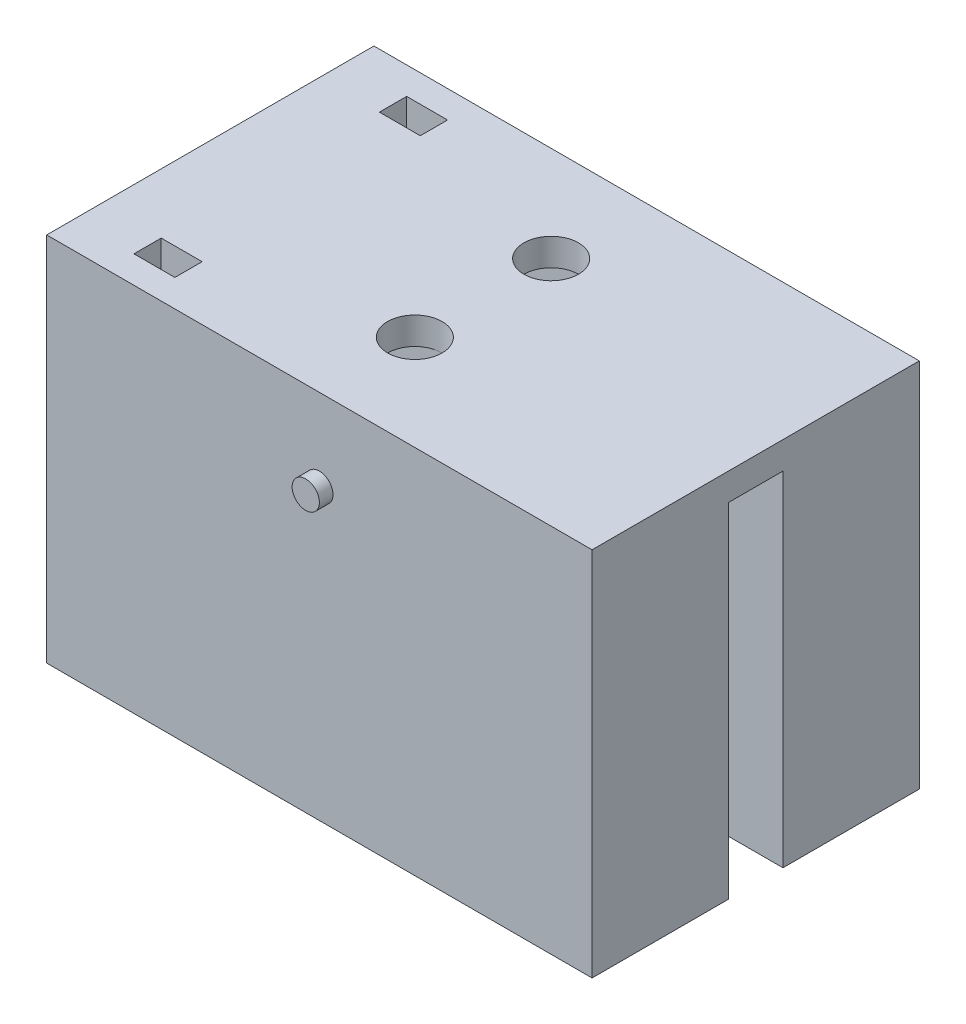
ISO-10303-21;
HEADER;
FILE_DESCRIPTION(('STEP AP214'),'2;1');
FILE_NAME('part.step','',(''),(''),'','','');
FILE_SCHEMA(('AUTOMOTIVE_DESIGN { 1 0 10303 214 1 1 1 1 }'));
ENDSEC;
DATA;
#1=APPLICATION_CONTEXT('core data for automotive mechanical design processes');
#2=APPLICATION_PROTOCOL_DEFINITION('international standard','automotive_design',2000,#1);
#3=PRODUCT_CONTEXT('',#1,'mechanical');
#4=PRODUCT('Part','Part','',(#3));
#5=PRODUCT_RELATED_PRODUCT_CATEGORY('part','',(#4));
#6=PRODUCT_DEFINITION_FORMATION('','',#4);
#7=PRODUCT_DEFINITION_CONTEXT('part definition',#1,'design');
#8=PRODUCT_DEFINITION('design','',#6,#7);
#9=PRODUCT_DEFINITION_SHAPE('','',#8);
#10=(LENGTH_UNIT() NAMED_UNIT(*) SI_UNIT(.MILLI.,.METRE.));
#11=(NAMED_UNIT(*) PLANE_ANGLE_UNIT() SI_UNIT($,.RADIAN.));
#12=(NAMED_UNIT(*) SI_UNIT($,.STERADIAN.) SOLID_ANGLE_UNIT());
#13=UNCERTAINTY_MEASURE_WITH_UNIT(LENGTH_MEASURE(1.E-05),#10,'distance_accuracy_value','');
#14=(GEOMETRIC_REPRESENTATION_CONTEXT(3) GLOBAL_UNCERTAINTY_ASSIGNED_CONTEXT((#13)) GLOBAL_UNIT_ASSIGNED_CONTEXT((#10,
#11,#12)) REPRESENTATION_CONTEXT('',''));
#15=CARTESIAN_POINT('',(0.,0.,0.));
#16=DIRECTION('',(0.,0.,1.));
#17=DIRECTION('',(1.,0.,0.));
#18=AXIS2_PLACEMENT_3D('',#15,#16,#17);
#19=CARTESIAN_POINT('',(90.,-116.,50.));
#20=DIRECTION('',(-1.,0.,0.));
#21=DIRECTION('',(0.,0.,1.));
#22=AXIS2_PLACEMENT_3D('',#19,#20,#21);
#23=PLANE('',#22);
#24=DIRECTION('',(0.,0.,1.));
#25=VECTOR('',#24,1.);
#26=CARTESIAN_POINT('',(90.,-116.,50.));
#27=LINE('',#26,#25);
#28=CARTESIAN_POINT('',(90.,-116.,-50.));
#29=VERTEX_POINT('',#28);
#30=CARTESIAN_POINT('',(90.,-116.,-15.));
#31=VERTEX_POINT('',#30);
#32=EDGE_CURVE('E219',#29,#31,#27,.T.);
#33=ORIENTED_EDGE('',*,*,#32,.T.);
#34=DIRECTION('',(0.,1.,0.));
#35=VECTOR('',#34,1.);
#36=CARTESIAN_POINT('',(90.,-116.,-15.));
#37=LINE('',#36,#35);
#38=CARTESIAN_POINT('',(90.,0.,-15.));
#39=VERTEX_POINT('',#38);
#40=EDGE_CURVE('E218',#31,#39,#37,.T.);
#41=ORIENTED_EDGE('',*,*,#40,.T.);
#42=DIRECTION('',(0.,0.,1.));
#43=VECTOR('',#42,1.);
#44=CARTESIAN_POINT('',(90.,0.,50.));
#45=LINE('',#44,#43);
#46=CARTESIAN_POINT('',(90.,0.,-50.));
#47=VERTEX_POINT('',#46);
#48=EDGE_CURVE('E204',#47,#39,#45,.T.);
#49=ORIENTED_EDGE('',*,*,#48,.F.);
#50=DIRECTION('',(0.,1.,0.));
#51=VECTOR('',#50,1.);
#52=CARTESIAN_POINT('',(90.,-116.,-50.));
#53=LINE('',#52,#51);
#54=EDGE_CURVE('E292',#29,#47,#53,.T.);
#55=ORIENTED_EDGE('',*,*,#54,.F.);
#56=EDGE_LOOP('',(#33,#41,#49,#55));
#57=FACE_BOUND('',#56,.T.);
#58=ADVANCED_FACE('F36',(#57),#23,.T.);
#59=CARTESIAN_POINT('',(-90.,-116.,50.));
#60=DIRECTION('',(1.,0.,0.));
#61=DIRECTION('',(0.,0.,-1.));
#62=AXIS2_PLACEMENT_3D('',#59,#60,#61);
#63=PLANE('',#62);
#64=DIRECTION('',(0.,0.,-1.));
#65=VECTOR('',#64,1.);
#66=CARTESIAN_POINT('',(-90.,0.,50.));
#67=LINE('',#66,#65);
#68=CARTESIAN_POINT('',(-90.,0.,-15.));
#69=VERTEX_POINT('',#68);
#70=CARTESIAN_POINT('',(-90.,0.,-50.));
#71=VERTEX_POINT('',#70);
#72=EDGE_CURVE('E295',#69,#71,#67,.T.);
#73=ORIENTED_EDGE('',*,*,#72,.F.);
#74=DIRECTION('',(0.,-1.,0.));
#75=VECTOR('',#74,1.);
#76=CARTESIAN_POINT('',(-90.,-116.,-15.));
#77=LINE('',#76,#75);
#78=CARTESIAN_POINT('',(-90.,-116.,-15.));
#79=VERTEX_POINT('',#78);
#80=EDGE_CURVE('E59',#69,#79,#77,.T.);
#81=ORIENTED_EDGE('',*,*,#80,.T.);
#82=DIRECTION('',(0.,0.,-1.));
#83=VECTOR('',#82,1.);
#84=CARTESIAN_POINT('',(-90.,-116.,50.));
#85=LINE('',#84,#83);
#86=CARTESIAN_POINT('',(-90.,-116.,-50.));
#87=VERTEX_POINT('',#86);
#88=EDGE_CURVE('E286',#79,#87,#85,.T.);
#89=ORIENTED_EDGE('',*,*,#88,.T.);
#90=DIRECTION('',(0.,1.,0.));
#91=VECTOR('',#90,1.);
#92=CARTESIAN_POINT('',(-90.,-116.,-50.));
#93=LINE('',#92,#91);
#94=EDGE_CURVE('E303',#87,#71,#93,.T.);
#95=ORIENTED_EDGE('',*,*,#94,.T.);
#96=EDGE_LOOP('',(#73,#81,#89,#95));
#97=FACE_BOUND('',#96,.T.);
#98=ADVANCED_FACE('F468',(#97),#63,.T.);
#99=CARTESIAN_POINT('',(0.,-116.,0.));
#100=DIRECTION('',(0.,-1.,0.));
#101=DIRECTION('',(0.,0.,-1.));
#102=AXIS2_PLACEMENT_3D('',#99,#100,#101);
#103=PLANE('',#102);
#104=DIRECTION('',(-1.,0.,0.));
#105=VECTOR('',#104,1.);
#106=CARTESIAN_POINT('',(0.,-116.,-15.));
#107=LINE('',#106,#105);
#108=EDGE_CURVE('E51',#31,#79,#107,.T.);
#109=ORIENTED_EDGE('',*,*,#108,.F.);
#110=ORIENTED_EDGE('',*,*,#32,.F.);
#111=DIRECTION('',(1.,0.,0.));
#112=VECTOR('',#111,1.);
#113=CARTESIAN_POINT('',(-90.,-116.,-50.));
#114=LINE('',#113,#112);
#115=EDGE_CURVE('E290',#87,#29,#114,.T.);
#116=ORIENTED_EDGE('',*,*,#115,.F.);
#117=ORIENTED_EDGE('',*,*,#88,.F.);
#118=EDGE_LOOP('',(#109,#110,#116,#117));
#119=FACE_BOUND('',#118,.T.);
#120=ADVANCED_FACE('F463',(#119),#103,.F.);
#121=CARTESIAN_POINT('',(0.,0.,0.));
#122=DIRECTION('',(0.,1.,0.));
#123=DIRECTION('',(0.,0.,1.));
#124=AXIS2_PLACEMENT_3D('',#121,#122,#123);
#125=PLANE('',#124);
#126=DIRECTION('',(-1.,0.,0.));
#127=VECTOR('',#126,1.);
#128=CARTESIAN_POINT('',(-100.,0.,-15.));
#129=LINE('',#128,#127);
#130=CARTESIAN_POINT('',(0.,0.,-15.));
#131=VERTEX_POINT('',#130);
#132=EDGE_CURVE('E225',#131,#69,#129,.T.);
#133=ORIENTED_EDGE('',*,*,#132,.T.);
#134=ORIENTED_EDGE('',*,*,#72,.T.);
#135=DIRECTION('',(1.,0.,0.));
#136=VECTOR('',#135,1.);
#137=CARTESIAN_POINT('',(-90.,0.,-50.));
#138=LINE('',#137,#136);
#139=CARTESIAN_POINT('',(-78.,0.,-50.));
#140=VERTEX_POINT('',#139);
#141=EDGE_CURVE('E300',#71,#140,#138,.T.);
#142=ORIENTED_EDGE('',*,*,#141,.T.);
#143=DIRECTION('',(0.,0.,1.));
#144=VECTOR('',#143,1.);
#145=CARTESIAN_POINT('',(-78.,0.,-40.));
#146=LINE('',#145,#144);
#147=CARTESIAN_POINT('',(-78.,0.,-40.));
#148=VERTEX_POINT('',#147);
#149=EDGE_CURVE('E315',#140,#148,#146,.T.);
#150=ORIENTED_EDGE('',*,*,#149,.T.);
#151=DIRECTION('',(1.,0.,0.));
#152=VECTOR('',#151,1.);
#153=CARTESIAN_POINT('',(-78.,0.,-40.));
#154=LINE('',#153,#152);
#155=CARTESIAN_POINT('',(-63.,0.,-40.));
#156=VERTEX_POINT('',#155);
#157=EDGE_CURVE('E311',#148,#156,#154,.T.);
#158=ORIENTED_EDGE('',*,*,#157,.T.);
#159=DIRECTION('',(0.,0.,-1.));
#160=VECTOR('',#159,1.);
#161=CARTESIAN_POINT('',(-63.,0.,-40.));
#162=LINE('',#161,#160);
#163=CARTESIAN_POINT('',(-63.,0.,-50.));
#164=VERTEX_POINT('',#163);
#165=EDGE_CURVE('E325',#156,#164,#162,.T.);
#166=ORIENTED_EDGE('',*,*,#165,.T.);
#167=EDGE_CURVE('E211',#164,#47,#138,.T.);
#168=ORIENTED_EDGE('',*,*,#167,.T.);
#169=ORIENTED_EDGE('',*,*,#48,.T.);
#170=EDGE_CURVE('E209',#39,#131,#129,.T.);
#171=ORIENTED_EDGE('',*,*,#170,.T.);
#172=CARTESIAN_POINT('',(0.,0.,-25.));
#173=DIRECTION('',(0.,1.,0.));
#174=DIRECTION('',(0.,0.,1.));
#175=AXIS2_PLACEMENT_3D('',#172,#173,#174);
#176=CIRCLE('',#175,10.);
#177=EDGE_CURVE('E373',#131,#131,#176,.T.);
#178=ORIENTED_EDGE('',*,*,#177,.T.);
#179=EDGE_LOOP('',(#133,#134,#142,#150,#158,#166,#168,#169,#171,#178));
#180=FACE_BOUND('',#179,.T.);
#181=ADVANCED_FACE('F206',(#180),#125,.F.);
#182=DIRECTION('',(1.,0.,0.));
#183=VECTOR('',#182,1.);
#184=CARTESIAN_POINT('',(100.,0.,15.));
#185=LINE('',#184,#183);
#186=CARTESIAN_POINT('',(0.,0.,15.));
#187=VERTEX_POINT('',#186);
#188=CARTESIAN_POINT('',(90.,0.,15.));
#189=VERTEX_POINT('',#188);
#190=EDGE_CURVE('E221',#187,#189,#185,.T.);
#191=ORIENTED_EDGE('',*,*,#190,.T.);
#192=CARTESIAN_POINT('',(90.,0.,50.));
#193=VERTEX_POINT('',#192);
#194=EDGE_CURVE('E215',#189,#193,#45,.T.);
#195=ORIENTED_EDGE('',*,*,#194,.T.);
#196=DIRECTION('',(-1.,0.,0.));
#197=VECTOR('',#196,1.);
#198=CARTESIAN_POINT('',(-90.,0.,50.));
#199=LINE('',#198,#197);
#200=CARTESIAN_POINT('',(-63.,0.,50.));
#201=VERTEX_POINT('',#200);
#202=EDGE_CURVE('E214',#193,#201,#199,.T.);
#203=ORIENTED_EDGE('',*,*,#202,.T.);
#204=DIRECTION('',(0.,0.,-1.));
#205=VECTOR('',#204,1.);
#206=CARTESIAN_POINT('',(-63.,0.,40.));
#207=LINE('',#206,#205);
#208=CARTESIAN_POINT('',(-63.,0.,40.));
#209=VERTEX_POINT('',#208);
#210=EDGE_CURVE('E340',#201,#209,#207,.T.);
#211=ORIENTED_EDGE('',*,*,#210,.T.);
#212=DIRECTION('',(-1.,0.,0.));
#213=VECTOR('',#212,1.);
#214=CARTESIAN_POINT('',(-78.,0.,40.));
#215=LINE('',#214,#213);
#216=CARTESIAN_POINT('',(-78.,0.,40.));
#217=VERTEX_POINT('',#216);
#218=EDGE_CURVE('E354',#209,#217,#215,.T.);
#219=ORIENTED_EDGE('',*,*,#218,.T.);
#220=DIRECTION('',(0.,0.,1.));
#221=VECTOR('',#220,1.);
#222=CARTESIAN_POINT('',(-78.,0.,40.));
#223=LINE('',#222,#221);
#224=CARTESIAN_POINT('',(-78.,0.,50.));
#225=VERTEX_POINT('',#224);
#226=EDGE_CURVE('E344',#217,#225,#223,.T.);
#227=ORIENTED_EDGE('',*,*,#226,.T.);
#228=CARTESIAN_POINT('',(-90.,0.,50.));
#229=VERTEX_POINT('',#228);
#230=EDGE_CURVE('E296',#225,#229,#199,.T.);
#231=ORIENTED_EDGE('',*,*,#230,.T.);
#232=CARTESIAN_POINT('',(-90.,0.,15.));
#233=VERTEX_POINT('',#232);
#234=EDGE_CURVE('E297',#229,#233,#67,.T.);
#235=ORIENTED_EDGE('',*,*,#234,.T.);
#236=EDGE_CURVE('E234',#233,#187,#185,.T.);
#237=ORIENTED_EDGE('',*,*,#236,.T.);
#238=CARTESIAN_POINT('',(0.,0.,25.));
#239=DIRECTION('',(0.,1.,0.));
#240=DIRECTION('',(0.,0.,-1.));
#241=AXIS2_PLACEMENT_3D('',#238,#239,#240);
#242=CIRCLE('',#241,9.99999999999999);
#243=EDGE_CURVE('E369',#187,#187,#242,.T.);
#244=ORIENTED_EDGE('',*,*,#243,.T.);
#245=EDGE_LOOP('',(#191,#195,#203,#211,#219,#227,#231,#235,#237,#244));
#246=FACE_BOUND('',#245,.T.);
#247=ADVANCED_FACE('F455',(#246),#125,.F.);
#248=ORIENTED_EDGE('',*,*,#194,.F.);
#249=DIRECTION('',(0.,-1.,0.));
#250=VECTOR('',#249,1.);
#251=CARTESIAN_POINT('',(90.,-116.,15.));
#252=LINE('',#251,#250);
#253=CARTESIAN_POINT('',(90.,-116.,15.));
#254=VERTEX_POINT('',#253);
#255=EDGE_CURVE('E240',#189,#254,#252,.T.);
#256=ORIENTED_EDGE('',*,*,#255,.T.);
#257=CARTESIAN_POINT('',(90.,-116.,50.));
#258=VERTEX_POINT('',#257);
#259=EDGE_CURVE('E283',#254,#258,#27,.T.);
#260=ORIENTED_EDGE('',*,*,#259,.T.);
#261=DIRECTION('',(0.,1.,0.));
#262=VECTOR('',#261,1.);
#263=CARTESIAN_POINT('',(90.,-116.,50.));
#264=LINE('',#263,#262);
#265=EDGE_CURVE('E308',#258,#193,#264,.T.);
#266=ORIENTED_EDGE('',*,*,#265,.T.);
#267=EDGE_LOOP('',(#248,#256,#260,#266));
#268=FACE_BOUND('',#267,.T.);
#269=ADVANCED_FACE('F465',(#268),#23,.T.);
#270=CARTESIAN_POINT('',(-90.,-116.,50.));
#271=VERTEX_POINT('',#270);
#272=CARTESIAN_POINT('',(-90.,-116.,15.));
#273=VERTEX_POINT('',#272);
#274=EDGE_CURVE('E287',#271,#273,#85,.T.);
#275=ORIENTED_EDGE('',*,*,#274,.T.);
#276=DIRECTION('',(0.,1.,0.));
#277=VECTOR('',#276,1.);
#278=CARTESIAN_POINT('',(-90.,-116.,15.));
#279=LINE('',#278,#277);
#280=EDGE_CURVE('E238',#273,#233,#279,.T.);
#281=ORIENTED_EDGE('',*,*,#280,.T.);
#282=ORIENTED_EDGE('',*,*,#234,.F.);
#283=DIRECTION('',(0.,1.,0.));
#284=VECTOR('',#283,1.);
#285=CARTESIAN_POINT('',(-90.,-116.,50.));
#286=LINE('',#285,#284);
#287=EDGE_CURVE('E306',#271,#229,#286,.T.);
#288=ORIENTED_EDGE('',*,*,#287,.F.);
#289=EDGE_LOOP('',(#275,#281,#282,#288));
#290=FACE_BOUND('',#289,.T.);
#291=ADVANCED_FACE('F474',(#290),#63,.T.);
#292=DIRECTION('',(1.,0.,0.));
#293=VECTOR('',#292,1.);
#294=CARTESIAN_POINT('',(0.,-116.,15.));
#295=LINE('',#294,#293);
#296=EDGE_CURVE('E235',#273,#254,#295,.T.);
#297=ORIENTED_EDGE('',*,*,#296,.F.);
#298=ORIENTED_EDGE('',*,*,#274,.F.);
#299=DIRECTION('',(-1.,0.,0.));
#300=VECTOR('',#299,1.);
#301=CARTESIAN_POINT('',(-90.,-116.,50.));
#302=LINE('',#301,#300);
#303=EDGE_CURVE('E282',#258,#271,#302,.T.);
#304=ORIENTED_EDGE('',*,*,#303,.F.);
#305=ORIENTED_EDGE('',*,*,#259,.F.);
#306=EDGE_LOOP('',(#297,#298,#304,#305));
#307=FACE_BOUND('',#306,.T.);
#308=ADVANCED_FACE('F481',(#307),#103,.F.);
#309=CARTESIAN_POINT('',(0.,-126.,0.));
#310=DIRECTION('',(0.,-1.,0.));
#311=DIRECTION('',(0.,0.,-1.));
#312=AXIS2_PLACEMENT_3D('',#309,#310,#311);
#313=PLANE('',#312);
#314=DIRECTION('',(0.,0.,-1.));
#315=VECTOR('',#314,1.);
#316=CARTESIAN_POINT('',(-100.,-126.,60.));
#317=LINE('',#316,#315);
#318=CARTESIAN_POINT('',(-100.,-126.,-10.));
#319=VERTEX_POINT('',#318);
#320=CARTESIAN_POINT('',(-100.,-126.,-60.));
#321=VERTEX_POINT('',#320);
#322=EDGE_CURVE('E275',#319,#321,#317,.T.);
#323=ORIENTED_EDGE('',*,*,#322,.T.);
#324=DIRECTION('',(1.,0.,0.));
#325=VECTOR('',#324,1.);
#326=CARTESIAN_POINT('',(-100.,-126.,-60.));
#327=LINE('',#326,#325);
#328=CARTESIAN_POINT('',(100.,-126.,-60.));
#329=VERTEX_POINT('',#328);
#330=EDGE_CURVE('E278',#321,#329,#327,.T.);
#331=ORIENTED_EDGE('',*,*,#330,.T.);
#332=DIRECTION('',(0.,0.,1.));
#333=VECTOR('',#332,1.);
#334=CARTESIAN_POINT('',(100.,-126.,60.));
#335=LINE('',#334,#333);
#336=CARTESIAN_POINT('',(100.,-126.,-10.));
#337=VERTEX_POINT('',#336);
#338=EDGE_CURVE('E270',#329,#337,#335,.T.);
#339=ORIENTED_EDGE('',*,*,#338,.T.);
#340=DIRECTION('',(1.,0.,0.));
#341=VECTOR('',#340,1.);
#342=CARTESIAN_POINT('',(-100.,-126.,-10.));
#343=LINE('',#342,#341);
#344=EDGE_CURVE('E248',#319,#337,#343,.T.);
#345=ORIENTED_EDGE('',*,*,#344,.F.);
#346=EDGE_LOOP('',(#323,#331,#339,#345));
#347=FACE_BOUND('',#346,.T.);
#348=ADVANCED_FACE('F446',(#347),#313,.T.);
#349=CARTESIAN_POINT('',(0.,10.,0.));
#350=DIRECTION('',(0.,1.,0.));
#351=DIRECTION('',(0.,0.,1.));
#352=AXIS2_PLACEMENT_3D('',#349,#350,#351);
#353=PLANE('',#352);
#354=CARTESIAN_POINT('',(0.,10.,-25.));
#355=DIRECTION('',(0.,1.,0.));
#356=DIRECTION('',(0.,0.,1.));
#357=AXIS2_PLACEMENT_3D('',#354,#355,#356);
#358=CIRCLE('',#357,10.);
#359=CARTESIAN_POINT('',(0.,10.,-15.));
#360=VERTEX_POINT('',#359);
#361=EDGE_CURVE('E376',#360,#360,#358,.T.);
#362=ORIENTED_EDGE('',*,*,#361,.F.);
#363=EDGE_LOOP('',(#362));
#364=FACE_BOUND('',#363,.T.);
#365=DIRECTION('',(0.,0.,-1.));
#366=VECTOR('',#365,1.);
#367=CARTESIAN_POINT('',(100.,10.,-60.));
#368=LINE('',#367,#366);
#369=CARTESIAN_POINT('',(100.,10.,60.));
#370=VERTEX_POINT('',#369);
#371=CARTESIAN_POINT('',(100.,10.,-60.));
#372=VERTEX_POINT('',#371);
#373=EDGE_CURVE('E379',#370,#372,#368,.T.);
#374=ORIENTED_EDGE('',*,*,#373,.T.);
#375=DIRECTION('',(-1.,0.,0.));
#376=VECTOR('',#375,1.);
#377=CARTESIAN_POINT('',(-100.,10.,-60.));
#378=LINE('',#377,#376);
#379=CARTESIAN_POINT('',(-100.,10.,-60.));
#380=VERTEX_POINT('',#379);
#381=EDGE_CURVE('E383',#372,#380,#378,.T.);
#382=ORIENTED_EDGE('',*,*,#381,.T.);
#383=DIRECTION('',(0.,0.,1.));
#384=VECTOR('',#383,1.);
#385=CARTESIAN_POINT('',(-100.,10.,-60.));
#386=LINE('',#385,#384);
#387=CARTESIAN_POINT('',(-100.,10.,60.));
#388=VERTEX_POINT('',#387);
#389=EDGE_CURVE('E385',#380,#388,#386,.T.);
#390=ORIENTED_EDGE('',*,*,#389,.T.);
#391=DIRECTION('',(1.,0.,0.));
#392=VECTOR('',#391,1.);
#393=CARTESIAN_POINT('',(-100.,10.,60.));
#394=LINE('',#393,#392);
#395=EDGE_CURVE('E387',#388,#370,#394,.T.);
#396=ORIENTED_EDGE('',*,*,#395,.T.);
#397=EDGE_LOOP('',(#374,#382,#390,#396));
#398=FACE_BOUND('',#397,.T.);
#399=CARTESIAN_POINT('',(0.,10.,25.));
#400=DIRECTION('',(0.,1.,0.));
#401=DIRECTION('',(0.,0.,-1.));
#402=AXIS2_PLACEMENT_3D('',#399,#400,#401);
#403=CIRCLE('',#402,9.99999999999999);
#404=CARTESIAN_POINT('',(0.,10.,15.));
#405=VERTEX_POINT('',#404);
#406=EDGE_CURVE('E370',#405,#405,#403,.T.);
#407=ORIENTED_EDGE('',*,*,#406,.F.);
#408=EDGE_LOOP('',(#407));
#409=FACE_BOUND('',#408,.T.);
#410=DIRECTION('',(-1.,0.,0.));
#411=VECTOR('',#410,1.);
#412=CARTESIAN_POINT('',(-78.,10.,40.));
#413=LINE('',#412,#411);
#414=CARTESIAN_POINT('',(-63.,10.,40.));
#415=VERTEX_POINT('',#414);
#416=CARTESIAN_POINT('',(-78.,10.,40.));
#417=VERTEX_POINT('',#416);
#418=EDGE_CURVE('E343',#415,#417,#413,.T.);
#419=ORIENTED_EDGE('',*,*,#418,.F.);
#420=DIRECTION('',(0.,0.,-1.));
#421=VECTOR('',#420,1.);
#422=CARTESIAN_POINT('',(-63.,10.,40.));
#423=LINE('',#422,#421);
#424=CARTESIAN_POINT('',(-63.,10.,50.));
#425=VERTEX_POINT('',#424);
#426=EDGE_CURVE('E341',#425,#415,#423,.T.);
#427=ORIENTED_EDGE('',*,*,#426,.F.);
#428=DIRECTION('',(1.,0.,0.));
#429=VECTOR('',#428,1.);
#430=CARTESIAN_POINT('',(-78.,10.,50.));
#431=LINE('',#430,#429);
#432=CARTESIAN_POINT('',(-78.,10.,50.));
#433=VERTEX_POINT('',#432);
#434=EDGE_CURVE('E349',#433,#425,#431,.T.);
#435=ORIENTED_EDGE('',*,*,#434,.F.);
#436=DIRECTION('',(0.,0.,1.));
#437=VECTOR('',#436,1.);
#438=CARTESIAN_POINT('',(-78.,10.,40.));
#439=LINE('',#438,#437);
#440=EDGE_CURVE('E346',#417,#433,#439,.T.);
#441=ORIENTED_EDGE('',*,*,#440,.F.);
#442=EDGE_LOOP('',(#419,#427,#435,#441));
#443=FACE_BOUND('',#442,.T.);
#444=DIRECTION('',(0.,0.,-1.));
#445=VECTOR('',#444,1.);
#446=CARTESIAN_POINT('',(-63.,10.,-40.));
#447=LINE('',#446,#445);
#448=CARTESIAN_POINT('',(-63.,10.,-40.));
#449=VERTEX_POINT('',#448);
#450=CARTESIAN_POINT('',(-63.,10.,-50.));
#451=VERTEX_POINT('',#450);
#452=EDGE_CURVE('E314',#449,#451,#447,.T.);
#453=ORIENTED_EDGE('',*,*,#452,.F.);
#454=DIRECTION('',(1.,0.,0.));
#455=VECTOR('',#454,1.);
#456=CARTESIAN_POINT('',(-78.,10.,-40.));
#457=LINE('',#456,#455);
#458=CARTESIAN_POINT('',(-78.,10.,-40.));
#459=VERTEX_POINT('',#458);
#460=EDGE_CURVE('E312',#459,#449,#457,.T.);
#461=ORIENTED_EDGE('',*,*,#460,.F.);
#462=DIRECTION('',(0.,0.,1.));
#463=VECTOR('',#462,1.);
#464=CARTESIAN_POINT('',(-78.,10.,-40.));
#465=LINE('',#464,#463);
#466=CARTESIAN_POINT('',(-78.,10.,-50.));
#467=VERTEX_POINT('',#466);
#468=EDGE_CURVE('E320',#467,#459,#465,.T.);
#469=ORIENTED_EDGE('',*,*,#468,.F.);
#470=DIRECTION('',(-1.,0.,0.));
#471=VECTOR('',#470,1.);
#472=CARTESIAN_POINT('',(-78.,10.,-50.));
#473=LINE('',#472,#471);
#474=EDGE_CURVE('E317',#451,#467,#473,.T.);
#475=ORIENTED_EDGE('',*,*,#474,.F.);
#476=EDGE_LOOP('',(#453,#461,#469,#475));
#477=FACE_BOUND('',#476,.T.);
#478=ADVANCED_FACE('F438',(#364,#398,#409,#443,#477),#353,.T.);
#479=DIRECTION('',(0.,0.,-1.));
#480=VECTOR('',#479,1.);
#481=CARTESIAN_POINT('',(-100.,0.,10.));
#482=LINE('',#481,#480);
#483=CARTESIAN_POINT('',(-100.,0.,10.));
#484=VERTEX_POINT('',#483);
#485=CARTESIAN_POINT('',(-100.,0.,-10.));
#486=VERTEX_POINT('',#485);
#487=EDGE_CURVE('E250',#484,#486,#482,.T.);
#488=ORIENTED_EDGE('',*,*,#487,.T.);
#489=DIRECTION('',(1.,0.,0.));
#490=VECTOR('',#489,1.);
#491=CARTESIAN_POINT('',(-100.,0.,-10.));
#492=LINE('',#491,#490);
#493=CARTESIAN_POINT('',(100.,0.,-10.));
#494=VERTEX_POINT('',#493);
#495=EDGE_CURVE('E253',#486,#494,#492,.T.);
#496=ORIENTED_EDGE('',*,*,#495,.T.);
#497=DIRECTION('',(0.,0.,1.));
#498=VECTOR('',#497,1.);
#499=CARTESIAN_POINT('',(100.,0.,10.));
#500=LINE('',#499,#498);
#501=CARTESIAN_POINT('',(100.,0.,10.));
#502=VERTEX_POINT('',#501);
#503=EDGE_CURVE('E244',#494,#502,#500,.T.);
#504=ORIENTED_EDGE('',*,*,#503,.T.);
#505=DIRECTION('',(-1.,0.,0.));
#506=VECTOR('',#505,1.);
#507=CARTESIAN_POINT('',(-100.,0.,10.));
#508=LINE('',#507,#506);
#509=EDGE_CURVE('E247',#502,#484,#508,.T.);
#510=ORIENTED_EDGE('',*,*,#509,.T.);
#511=EDGE_LOOP('',(#488,#496,#504,#510));
#512=FACE_BOUND('',#511,.T.);
#513=ADVANCED_FACE('F452',(#512),#125,.F.);
#514=CARTESIAN_POINT('',(100.,10.,-60.));
#515=DIRECTION('',(-1.,0.,0.));
#516=DIRECTION('',(0.,0.,1.));
#517=AXIS2_PLACEMENT_3D('',#514,#515,#516);
#518=PLANE('',#517);
#519=ORIENTED_EDGE('',*,*,#503,.F.);
#520=DIRECTION('',(0.,-1.,0.));
#521=VECTOR('',#520,1.);
#522=CARTESIAN_POINT('',(100.,0.,-10.));
#523=LINE('',#522,#521);
#524=EDGE_CURVE('E260',#494,#337,#523,.T.);
#525=ORIENTED_EDGE('',*,*,#524,.T.);
#526=ORIENTED_EDGE('',*,*,#338,.F.);
#527=DIRECTION('',(0.,-1.,0.));
#528=VECTOR('',#527,1.);
#529=CARTESIAN_POINT('',(100.,10.,-60.));
#530=LINE('',#529,#528);
#531=EDGE_CURVE('E397',#372,#329,#530,.T.);
#532=ORIENTED_EDGE('',*,*,#531,.F.);
#533=ORIENTED_EDGE('',*,*,#373,.F.);
#534=DIRECTION('',(0.,-1.,0.));
#535=VECTOR('',#534,1.);
#536=CARTESIAN_POINT('',(100.,10.,60.));
#537=LINE('',#536,#535);
#538=CARTESIAN_POINT('',(100.,-126.,60.));
#539=VERTEX_POINT('',#538);
#540=EDGE_CURVE('E389',#370,#539,#537,.T.);
#541=ORIENTED_EDGE('',*,*,#540,.T.);
#542=CARTESIAN_POINT('',(100.,-126.,10.));
#543=VERTEX_POINT('',#542);
#544=EDGE_CURVE('E263',#543,#539,#335,.T.);
#545=ORIENTED_EDGE('',*,*,#544,.F.);
#546=DIRECTION('',(0.,-1.,0.));
#547=VECTOR('',#546,1.);
#548=CARTESIAN_POINT('',(100.,0.,10.));
#549=LINE('',#548,#547);
#550=EDGE_CURVE('E255',#502,#543,#549,.T.);
#551=ORIENTED_EDGE('',*,*,#550,.F.);
#552=EDGE_LOOP('',(#519,#525,#526,#532,#533,#541,#545,#551));
#553=FACE_BOUND('',#552,.T.);
#554=ADVANCED_FACE('F38',(#553),#518,.F.);
#555=CARTESIAN_POINT('',(-100.,10.,-60.));
#556=DIRECTION('',(0.,0.,1.));
#557=DIRECTION('',(1.,0.,0.));
#558=AXIS2_PLACEMENT_3D('',#555,#556,#557);
#559=PLANE('',#558);
#560=CARTESIAN_POINT('',(0.,-20.,-60.));
#561=DIRECTION('',(0.,0.,1.));
#562=DIRECTION('',(1.,0.,0.));
#563=AXIS2_PLACEMENT_3D('',#560,#561,#562);
#564=CIRCLE('',#563,5.);
#565=CARTESIAN_POINT('',(5.,-20.,-60.));
#566=VERTEX_POINT('',#565);
#567=EDGE_CURVE('E11',#566,#566,#564,.F.);
#568=ORIENTED_EDGE('',*,*,#567,.F.);
#569=EDGE_LOOP('',(#568));
#570=FACE_BOUND('',#569,.T.);
#571=ORIENTED_EDGE('',*,*,#531,.T.);
#572=ORIENTED_EDGE('',*,*,#330,.F.);
#573=DIRECTION('',(0.,-1.,0.));
#574=VECTOR('',#573,1.);
#575=CARTESIAN_POINT('',(-100.,10.,-60.));
#576=LINE('',#575,#574);
#577=EDGE_CURVE('E394',#380,#321,#576,.T.);
#578=ORIENTED_EDGE('',*,*,#577,.F.);
#579=ORIENTED_EDGE('',*,*,#381,.F.);
#580=EDGE_LOOP('',(#571,#572,#578,#579));
#581=FACE_BOUND('',#580,.T.);
#582=ADVANCED_FACE('F444',(#570,#581),#559,.F.);
#583=CARTESIAN_POINT('',(-100.,10.,-60.));
#584=DIRECTION('',(1.,0.,0.));
#585=DIRECTION('',(0.,0.,-1.));
#586=AXIS2_PLACEMENT_3D('',#583,#584,#585);
#587=PLANE('',#586);
#588=DIRECTION('',(0.,-1.,0.));
#589=VECTOR('',#588,1.);
#590=CARTESIAN_POINT('',(-100.,0.,-10.));
#591=LINE('',#590,#589);
#592=EDGE_CURVE('E264',#486,#319,#591,.T.);
#593=ORIENTED_EDGE('',*,*,#592,.F.);
#594=ORIENTED_EDGE('',*,*,#487,.F.);
#595=DIRECTION('',(0.,-1.,0.));
#596=VECTOR('',#595,1.);
#597=CARTESIAN_POINT('',(-100.,0.,10.));
#598=LINE('',#597,#596);
#599=CARTESIAN_POINT('',(-100.,-126.,10.));
#600=VERTEX_POINT('',#599);
#601=EDGE_CURVE('E266',#484,#600,#598,.T.);
#602=ORIENTED_EDGE('',*,*,#601,.T.);
#603=CARTESIAN_POINT('',(-100.,-126.,60.));
#604=VERTEX_POINT('',#603);
#605=EDGE_CURVE('E276',#604,#600,#317,.T.);
#606=ORIENTED_EDGE('',*,*,#605,.F.);
#607=DIRECTION('',(0.,-1.,0.));
#608=VECTOR('',#607,1.);
#609=CARTESIAN_POINT('',(-100.,10.,60.));
#610=LINE('',#609,#608);
#611=EDGE_CURVE('E392',#388,#604,#610,.T.);
#612=ORIENTED_EDGE('',*,*,#611,.F.);
#613=ORIENTED_EDGE('',*,*,#389,.F.);
#614=ORIENTED_EDGE('',*,*,#577,.T.);
#615=ORIENTED_EDGE('',*,*,#322,.F.);
#616=EDGE_LOOP('',(#593,#594,#602,#606,#612,#613,#614,#615));
#617=FACE_BOUND('',#616,.T.);
#618=ADVANCED_FACE('F413',(#617),#587,.F.);
#619=CARTESIAN_POINT('',(-100.,10.,60.));
#620=DIRECTION('',(0.,0.,-1.));
#621=DIRECTION('',(-1.,0.,0.));
#622=AXIS2_PLACEMENT_3D('',#619,#620,#621);
#623=PLANE('',#622);
#624=CARTESIAN_POINT('',(0.,-20.,60.));
#625=DIRECTION('',(0.,0.,-1.));
#626=DIRECTION('',(-1.,0.,0.));
#627=AXIS2_PLACEMENT_3D('',#624,#625,#626);
#628=CIRCLE('',#627,5.);
#629=CARTESIAN_POINT('',(-5.,-20.,60.));
#630=VERTEX_POINT('',#629);
#631=EDGE_CURVE('E44',#630,#630,#628,.F.);
#632=ORIENTED_EDGE('',*,*,#631,.F.);
#633=EDGE_LOOP('',(#632));
#634=FACE_BOUND('',#633,.T.);
#635=ORIENTED_EDGE('',*,*,#611,.T.);
#636=DIRECTION('',(-1.,0.,0.));
#637=VECTOR('',#636,1.);
#638=CARTESIAN_POINT('',(-100.,-126.,60.));
#639=LINE('',#638,#637);
#640=EDGE_CURVE('E272',#539,#604,#639,.T.);
#641=ORIENTED_EDGE('',*,*,#640,.F.);
#642=ORIENTED_EDGE('',*,*,#540,.F.);
#643=ORIENTED_EDGE('',*,*,#395,.F.);
#644=EDGE_LOOP('',(#635,#641,#642,#643));
#645=FACE_BOUND('',#644,.T.);
#646=ADVANCED_FACE('F409',(#634,#645),#623,.F.);
#647=CARTESIAN_POINT('',(0.,10.,-25.));
#648=DIRECTION('',(0.,-1.,0.));
#649=DIRECTION('',(0.,0.,-1.));
#650=AXIS2_PLACEMENT_3D('',#647,#648,#649);
#651=CYLINDRICAL_SURFACE('',#650,10.);
#652=ORIENTED_EDGE('',*,*,#361,.T.);
#653=EDGE_LOOP('',(#652));
#654=FACE_BOUND('',#653,.T.);
#655=ORIENTED_EDGE('',*,*,#177,.F.);
#656=EDGE_LOOP('',(#655));
#657=FACE_BOUND('',#656,.T.);
#658=ADVANCED_FACE('F412',(#654,#657),#651,.F.);
#659=CARTESIAN_POINT('',(0.,10.,25.));
#660=DIRECTION('',(0.,-1.,0.));
#661=DIRECTION('',(0.,0.,-1.));
#662=AXIS2_PLACEMENT_3D('',#659,#660,#661);
#663=CYLINDRICAL_SURFACE('',#662,9.99999999999999);
#664=ORIENTED_EDGE('',*,*,#406,.T.);
#665=EDGE_LOOP('',(#664));
#666=FACE_BOUND('',#665,.T.);
#667=ORIENTED_EDGE('',*,*,#243,.F.);
#668=EDGE_LOOP('',(#667));
#669=FACE_BOUND('',#668,.T.);
#670=ADVANCED_FACE('F518',(#666,#669),#663,.F.);
#671=CARTESIAN_POINT('',(-63.,10.,40.));
#672=DIRECTION('',(-1.,0.,0.));
#673=DIRECTION('',(0.,0.,1.));
#674=AXIS2_PLACEMENT_3D('',#671,#672,#673);
#675=PLANE('',#674);
#676=ORIENTED_EDGE('',*,*,#210,.F.);
#677=DIRECTION('',(0.,-1.,0.));
#678=VECTOR('',#677,1.);
#679=CARTESIAN_POINT('',(-63.,10.,50.));
#680=LINE('',#679,#678);
#681=EDGE_CURVE('E351',#425,#201,#680,.T.);
#682=ORIENTED_EDGE('',*,*,#681,.F.);
#683=ORIENTED_EDGE('',*,*,#426,.T.);
#684=DIRECTION('',(0.,-1.,0.));
#685=VECTOR('',#684,1.);
#686=CARTESIAN_POINT('',(-63.,10.,40.));
#687=LINE('',#686,#685);
#688=EDGE_CURVE('E366',#415,#209,#687,.T.);
#689=ORIENTED_EDGE('',*,*,#688,.T.);
#690=EDGE_LOOP('',(#676,#682,#683,#689));
#691=FACE_BOUND('',#690,.T.);
#692=ADVANCED_FACE('F502',(#691),#675,.T.);
#693=CARTESIAN_POINT('',(-78.,10.,40.));
#694=DIRECTION('',(0.,0.,1.));
#695=DIRECTION('',(1.,0.,0.));
#696=AXIS2_PLACEMENT_3D('',#693,#694,#695);
#697=PLANE('',#696);
#698=ORIENTED_EDGE('',*,*,#218,.F.);
#699=ORIENTED_EDGE('',*,*,#688,.F.);
#700=ORIENTED_EDGE('',*,*,#418,.T.);
#701=DIRECTION('',(0.,-1.,0.));
#702=VECTOR('',#701,1.);
#703=CARTESIAN_POINT('',(-78.,10.,40.));
#704=LINE('',#703,#702);
#705=EDGE_CURVE('E364',#417,#217,#704,.T.);
#706=ORIENTED_EDGE('',*,*,#705,.T.);
#707=EDGE_LOOP('',(#698,#699,#700,#706));
#708=FACE_BOUND('',#707,.T.);
#709=ADVANCED_FACE('F507',(#708),#697,.T.);
#710=CARTESIAN_POINT('',(-78.,10.,40.));
#711=DIRECTION('',(1.,0.,0.));
#712=DIRECTION('',(0.,0.,-1.));
#713=AXIS2_PLACEMENT_3D('',#710,#711,#712);
#714=PLANE('',#713);
#715=ORIENTED_EDGE('',*,*,#226,.F.);
#716=ORIENTED_EDGE('',*,*,#705,.F.);
#717=ORIENTED_EDGE('',*,*,#440,.T.);
#718=DIRECTION('',(0.,-1.,0.));
#719=VECTOR('',#718,1.);
#720=CARTESIAN_POINT('',(-78.,10.,50.));
#721=LINE('',#720,#719);
#722=EDGE_CURVE('E361',#433,#225,#721,.T.);
#723=ORIENTED_EDGE('',*,*,#722,.T.);
#724=EDGE_LOOP('',(#715,#716,#717,#723));
#725=FACE_BOUND('',#724,.T.);
#726=ADVANCED_FACE('F515',(#725),#714,.T.);
#727=CARTESIAN_POINT('',(-78.,10.,50.));
#728=DIRECTION('',(0.,0.,-1.));
#729=DIRECTION('',(-1.,0.,0.));
#730=AXIS2_PLACEMENT_3D('',#727,#728,#729);
#731=PLANE('',#730);
#732=ORIENTED_EDGE('',*,*,#681,.T.);
#733=ORIENTED_EDGE('',*,*,#202,.F.);
#734=ORIENTED_EDGE('',*,*,#265,.F.);
#735=ORIENTED_EDGE('',*,*,#303,.T.);
#736=ORIENTED_EDGE('',*,*,#287,.T.);
#737=ORIENTED_EDGE('',*,*,#230,.F.);
#738=ORIENTED_EDGE('',*,*,#722,.F.);
#739=ORIENTED_EDGE('',*,*,#434,.T.);
#740=EDGE_LOOP('',(#732,#733,#734,#735,#736,#737,#738,#739));
#741=FACE_BOUND('',#740,.T.);
#742=ADVANCED_FACE('F498',(#741),#731,.T.);
#743=CARTESIAN_POINT('',(-78.,10.,-40.));
#744=DIRECTION('',(0.,0.,-1.));
#745=DIRECTION('',(-1.,0.,0.));
#746=AXIS2_PLACEMENT_3D('',#743,#744,#745);
#747=PLANE('',#746);
#748=ORIENTED_EDGE('',*,*,#157,.F.);
#749=DIRECTION('',(0.,-1.,0.));
#750=VECTOR('',#749,1.);
#751=CARTESIAN_POINT('',(-78.,10.,-40.));
#752=LINE('',#751,#750);
#753=EDGE_CURVE('E322',#459,#148,#752,.T.);
#754=ORIENTED_EDGE('',*,*,#753,.F.);
#755=ORIENTED_EDGE('',*,*,#460,.T.);
#756=DIRECTION('',(0.,-1.,0.));
#757=VECTOR('',#756,1.);
#758=CARTESIAN_POINT('',(-63.,10.,-40.));
#759=LINE('',#758,#757);
#760=EDGE_CURVE('E337',#449,#156,#759,.T.);
#761=ORIENTED_EDGE('',*,*,#760,.T.);
#762=EDGE_LOOP('',(#748,#754,#755,#761));
#763=FACE_BOUND('',#762,.T.);
#764=ADVANCED_FACE('F536',(#763),#747,.T.);
#765=CARTESIAN_POINT('',(-63.,10.,-40.));
#766=DIRECTION('',(-1.,0.,0.));
#767=DIRECTION('',(0.,0.,1.));
#768=AXIS2_PLACEMENT_3D('',#765,#766,#767);
#769=PLANE('',#768);
#770=ORIENTED_EDGE('',*,*,#165,.F.);
#771=ORIENTED_EDGE('',*,*,#760,.F.);
#772=ORIENTED_EDGE('',*,*,#452,.T.);
#773=DIRECTION('',(0.,-1.,0.));
#774=VECTOR('',#773,1.);
#775=CARTESIAN_POINT('',(-63.,10.,-50.));
#776=LINE('',#775,#774);
#777=EDGE_CURVE('E334',#451,#164,#776,.T.);
#778=ORIENTED_EDGE('',*,*,#777,.T.);
#779=EDGE_LOOP('',(#770,#771,#772,#778));
#780=FACE_BOUND('',#779,.T.);
#781=ADVANCED_FACE('F539',(#780),#769,.T.);
#782=CARTESIAN_POINT('',(-78.,10.,-50.));
#783=DIRECTION('',(0.,0.,1.));
#784=DIRECTION('',(1.,0.,0.));
#785=AXIS2_PLACEMENT_3D('',#782,#783,#784);
#786=PLANE('',#785);
#787=DIRECTION('',(0.,-1.,0.));
#788=VECTOR('',#787,1.);
#789=CARTESIAN_POINT('',(-78.,10.,-50.));
#790=LINE('',#789,#788);
#791=EDGE_CURVE('E331',#467,#140,#790,.T.);
#792=ORIENTED_EDGE('',*,*,#791,.T.);
#793=ORIENTED_EDGE('',*,*,#141,.F.);
#794=ORIENTED_EDGE('',*,*,#94,.F.);
#795=ORIENTED_EDGE('',*,*,#115,.T.);
#796=ORIENTED_EDGE('',*,*,#54,.T.);
#797=ORIENTED_EDGE('',*,*,#167,.F.);
#798=ORIENTED_EDGE('',*,*,#777,.F.);
#799=ORIENTED_EDGE('',*,*,#474,.T.);
#800=EDGE_LOOP('',(#792,#793,#794,#795,#796,#797,#798,#799));
#801=FACE_BOUND('',#800,.T.);
#802=ADVANCED_FACE('F543',(#801),#786,.T.);
#803=CARTESIAN_POINT('',(-78.,10.,-40.));
#804=DIRECTION('',(1.,0.,0.));
#805=DIRECTION('',(0.,0.,-1.));
#806=AXIS2_PLACEMENT_3D('',#803,#804,#805);
#807=PLANE('',#806);
#808=ORIENTED_EDGE('',*,*,#149,.F.);
#809=ORIENTED_EDGE('',*,*,#791,.F.);
#810=ORIENTED_EDGE('',*,*,#468,.T.);
#811=ORIENTED_EDGE('',*,*,#753,.T.);
#812=EDGE_LOOP('',(#808,#809,#810,#811));
#813=FACE_BOUND('',#812,.T.);
#814=ADVANCED_FACE('F546',(#813),#807,.T.);
#815=ORIENTED_EDGE('',*,*,#544,.T.);
#816=ORIENTED_EDGE('',*,*,#640,.T.);
#817=ORIENTED_EDGE('',*,*,#605,.T.);
#818=DIRECTION('',(-1.,0.,0.));
#819=VECTOR('',#818,1.);
#820=CARTESIAN_POINT('',(-100.,-126.,10.));
#821=LINE('',#820,#819);
#822=EDGE_CURVE('E243',#543,#600,#821,.T.);
#823=ORIENTED_EDGE('',*,*,#822,.F.);
#824=EDGE_LOOP('',(#815,#816,#817,#823));
#825=FACE_BOUND('',#824,.T.);
#826=ADVANCED_FACE('F423',(#825),#313,.T.);
#827=CARTESIAN_POINT('',(-100.,0.,-10.));
#828=DIRECTION('',(0.,0.,-1.));
#829=DIRECTION('',(-1.,0.,0.));
#830=AXIS2_PLACEMENT_3D('',#827,#828,#829);
#831=PLANE('',#830);
#832=CARTESIAN_POINT('',(0.,-20.,-10.));
#833=DIRECTION('',(0.,0.,-1.));
#834=DIRECTION('',(-1.,0.,0.));
#835=AXIS2_PLACEMENT_3D('',#832,#833,#834);
#836=CIRCLE('',#835,8.);
#837=CARTESIAN_POINT('',(-8.,-20.,-10.));
#838=VERTEX_POINT('',#837);
#839=EDGE_CURVE('E402',#838,#838,#836,.F.);
#840=ORIENTED_EDGE('',*,*,#839,.F.);
#841=EDGE_LOOP('',(#840));
#842=FACE_BOUND('',#841,.T.);
#843=ORIENTED_EDGE('',*,*,#495,.F.);
#844=ORIENTED_EDGE('',*,*,#592,.T.);
#845=ORIENTED_EDGE('',*,*,#344,.T.);
#846=ORIENTED_EDGE('',*,*,#524,.F.);
#847=EDGE_LOOP('',(#843,#844,#845,#846));
#848=FACE_BOUND('',#847,.T.);
#849=ADVANCED_FACE('F450',(#842,#848),#831,.F.);
#850=CARTESIAN_POINT('',(-100.,0.,10.));
#851=DIRECTION('',(0.,0.,1.));
#852=DIRECTION('',(1.,0.,0.));
#853=AXIS2_PLACEMENT_3D('',#850,#851,#852);
#854=PLANE('',#853);
#855=CARTESIAN_POINT('',(0.,-20.,10.));
#856=DIRECTION('',(0.,0.,1.));
#857=DIRECTION('',(1.,0.,0.));
#858=AXIS2_PLACEMENT_3D('',#855,#856,#857);
#859=CIRCLE('',#858,8.);
#860=CARTESIAN_POINT('',(8.,-20.,10.));
#861=VERTEX_POINT('',#860);
#862=EDGE_CURVE('E399',#861,#861,#859,.F.);
#863=ORIENTED_EDGE('',*,*,#862,.F.);
#864=EDGE_LOOP('',(#863));
#865=FACE_BOUND('',#864,.T.);
#866=ORIENTED_EDGE('',*,*,#509,.F.);
#867=ORIENTED_EDGE('',*,*,#550,.T.);
#868=ORIENTED_EDGE('',*,*,#822,.T.);
#869=ORIENTED_EDGE('',*,*,#601,.F.);
#870=EDGE_LOOP('',(#866,#867,#868,#869));
#871=FACE_BOUND('',#870,.T.);
#872=ADVANCED_FACE('F430',(#865,#871),#854,.F.);
#873=CARTESIAN_POINT('',(0.,0.,15.));
#874=DIRECTION('',(0.,0.,-1.));
#875=DIRECTION('',(-1.,0.,0.));
#876=AXIS2_PLACEMENT_3D('',#873,#874,#875);
#877=PLANE('',#876);
#878=ORIENTED_EDGE('',*,*,#255,.F.);
#879=ORIENTED_EDGE('',*,*,#190,.F.);
#880=ORIENTED_EDGE('',*,*,#236,.F.);
#881=ORIENTED_EDGE('',*,*,#280,.F.);
#882=ORIENTED_EDGE('',*,*,#296,.T.);
#883=EDGE_LOOP('',(#878,#879,#880,#881,#882));
#884=FACE_BOUND('',#883,.T.);
#885=ADVANCED_FACE('F489',(#884),#877,.F.);
#886=CARTESIAN_POINT('',(0.,0.,-15.));
#887=DIRECTION('',(0.,0.,1.));
#888=DIRECTION('',(1.,0.,0.));
#889=AXIS2_PLACEMENT_3D('',#886,#887,#888);
#890=PLANE('',#889);
#891=ORIENTED_EDGE('',*,*,#40,.F.);
#892=ORIENTED_EDGE('',*,*,#108,.T.);
#893=ORIENTED_EDGE('',*,*,#80,.F.);
#894=ORIENTED_EDGE('',*,*,#132,.F.);
#895=ORIENTED_EDGE('',*,*,#170,.F.);
#896=EDGE_LOOP('',(#891,#892,#893,#894,#895));
#897=FACE_BOUND('',#896,.T.);
#898=ADVANCED_FACE('F224',(#897),#890,.F.);
#899=CARTESIAN_POINT('',(0.,-20.,10.));
#900=DIRECTION('',(0.,0.,-1.));
#901=DIRECTION('',(-1.,0.,0.));
#902=AXIS2_PLACEMENT_3D('',#899,#900,#901);
#903=CYLINDRICAL_SURFACE('',#902,8.);
#904=ORIENTED_EDGE('',*,*,#862,.T.);
#905=EDGE_LOOP('',(#904));
#906=FACE_BOUND('',#905,.T.);
#907=ORIENTED_EDGE('',*,*,#839,.T.);
#908=EDGE_LOOP('',(#907));
#909=FACE_BOUND('',#908,.T.);
#910=ADVANCED_FACE('F586',(#906,#909),#903,.T.);
#911=CARTESIAN_POINT('',(0.,-20.,65.));
#912=DIRECTION('',(0.,0.,-1.));
#913=DIRECTION('',(-1.,0.,0.));
#914=AXIS2_PLACEMENT_3D('',#911,#912,#913);
#915=CYLINDRICAL_SURFACE('',#914,5.);
#916=CARTESIAN_POINT('',(0.,-20.,65.));
#917=DIRECTION('',(0.,0.,1.));
#918=DIRECTION('',(1.,0.,0.));
#919=AXIS2_PLACEMENT_3D('',#916,#917,#918);
#920=CIRCLE('',#919,5.);
#921=CARTESIAN_POINT('',(5.,-20.,65.));
#922=VERTEX_POINT('',#921);
#923=EDGE_CURVE('E228',#922,#922,#920,.T.);
#924=ORIENTED_EDGE('',*,*,#923,.F.);
#925=EDGE_LOOP('',(#924));
#926=FACE_BOUND('',#925,.T.);
#927=ORIENTED_EDGE('',*,*,#631,.T.);
#928=EDGE_LOOP('',(#927));
#929=FACE_BOUND('',#928,.T.);
#930=ADVANCED_FACE('F407',(#926,#929),#915,.T.);
#931=CARTESIAN_POINT('',(0.,-20.,65.));
#932=DIRECTION('',(0.,0.,1.));
#933=DIRECTION('',(1.,0.,0.));
#934=AXIS2_PLACEMENT_3D('',#931,#932,#933);
#935=PLANE('',#934);
#936=ORIENTED_EDGE('',*,*,#923,.T.);
#937=EDGE_LOOP('',(#936));
#938=FACE_BOUND('',#937,.T.);
#939=ADVANCED_FACE('F592',(#938),#935,.T.);
#940=CARTESIAN_POINT('',(0.,-20.,-65.));
#941=DIRECTION('',(0.,0.,1.));
#942=DIRECTION('',(1.,0.,0.));
#943=AXIS2_PLACEMENT_3D('',#940,#941,#942);
#944=CYLINDRICAL_SURFACE('',#943,5.);
#945=CARTESIAN_POINT('',(0.,-20.,-65.));
#946=DIRECTION('',(0.,0.,-1.));
#947=DIRECTION('',(-1.,0.,0.));
#948=AXIS2_PLACEMENT_3D('',#945,#946,#947);
#949=CIRCLE('',#948,5.);
#950=CARTESIAN_POINT('',(-5.,-20.,-65.));
#951=VERTEX_POINT('',#950);
#952=EDGE_CURVE('E608',#951,#951,#949,.T.);
#953=ORIENTED_EDGE('',*,*,#952,.F.);
#954=EDGE_LOOP('',(#953));
#955=FACE_BOUND('',#954,.T.);
#956=ORIENTED_EDGE('',*,*,#567,.T.);
#957=EDGE_LOOP('',(#956));
#958=FACE_BOUND('',#957,.T.);
#959=ADVANCED_FACE('F596',(#955,#958),#944,.T.);
#960=CARTESIAN_POINT('',(0.,-20.,-65.));
#961=DIRECTION('',(0.,0.,-1.));
#962=DIRECTION('',(-1.,0.,0.));
#963=AXIS2_PLACEMENT_3D('',#960,#961,#962);
#964=PLANE('',#963);
#965=ORIENTED_EDGE('',*,*,#952,.T.);
#966=EDGE_LOOP('',(#965));
#967=FACE_BOUND('',#966,.T.);
#968=ADVANCED_FACE('F600',(#967),#964,.T.);
#969=CLOSED_SHELL('',(#58,#98,#120,#181,#247,#269,#291,#308,#348,#478,#513,#554,#582,#618,#646,
#658,#670,#692,#709,#726,#742,#764,#781,#802,#814,#826,#849,#872,#885,#898,#910,#930,#939,#959,#968));
#970=MANIFOLD_SOLID_BREP('B2',#969);
#971=ADVANCED_BREP_SHAPE_REPRESENTATION('',(#18,#970),#14);
#972=SHAPE_DEFINITION_REPRESENTATION(#9,#971);
ENDSEC;
END-ISO-10303-21;
